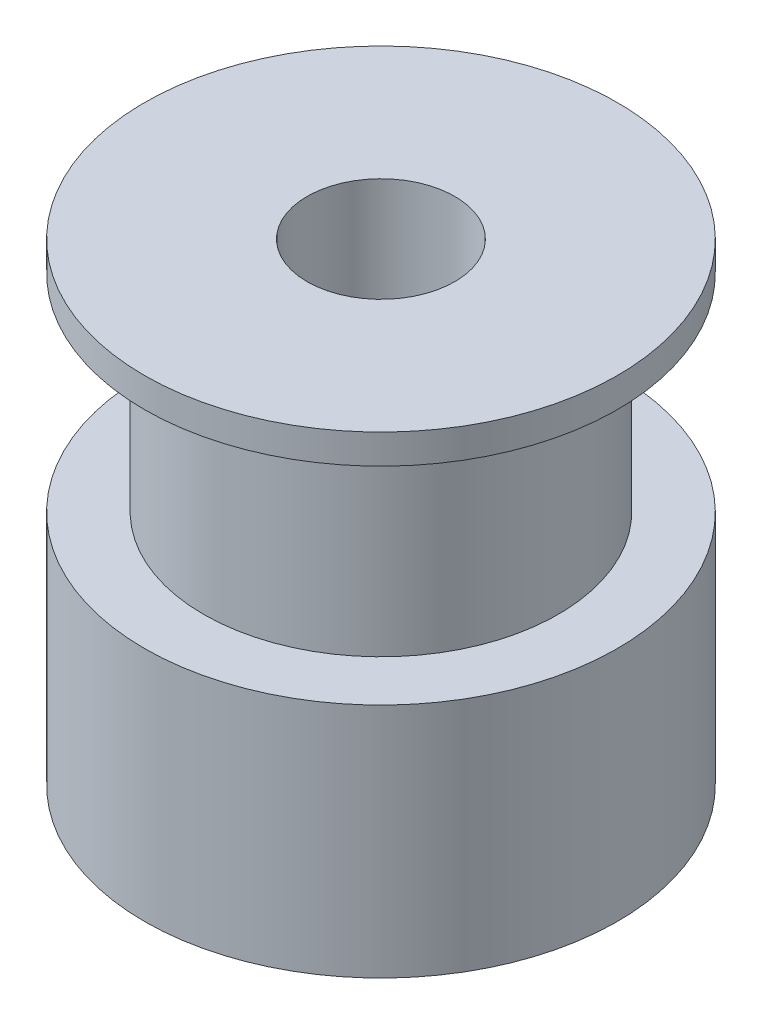
ISO-10303-21;
HEADER;
FILE_DESCRIPTION(('STEP AP214'),'2;1');
FILE_NAME('part.step','',(''),(''),'','','');
FILE_SCHEMA(('AUTOMOTIVE_DESIGN { 1 0 10303 214 1 1 1 1 }'));
ENDSEC;
DATA;
#1=APPLICATION_CONTEXT('core data for automotive mechanical design processes');
#2=APPLICATION_PROTOCOL_DEFINITION('international standard','automotive_design',2000,#1);
#3=PRODUCT_CONTEXT('',#1,'mechanical');
#4=PRODUCT('Part','Part','',(#3));
#5=PRODUCT_RELATED_PRODUCT_CATEGORY('part','',(#4));
#6=PRODUCT_DEFINITION_FORMATION('','',#4);
#7=PRODUCT_DEFINITION_CONTEXT('part definition',#1,'design');
#8=PRODUCT_DEFINITION('design','',#6,#7);
#9=PRODUCT_DEFINITION_SHAPE('','',#8);
#10=(LENGTH_UNIT() NAMED_UNIT(*) SI_UNIT(.MILLI.,.METRE.));
#11=(NAMED_UNIT(*) PLANE_ANGLE_UNIT() SI_UNIT($,.RADIAN.));
#12=(NAMED_UNIT(*) SI_UNIT($,.STERADIAN.) SOLID_ANGLE_UNIT());
#13=UNCERTAINTY_MEASURE_WITH_UNIT(LENGTH_MEASURE(1.E-05),#10,'distance_accuracy_value','');
#14=(GEOMETRIC_REPRESENTATION_CONTEXT(3) GLOBAL_UNCERTAINTY_ASSIGNED_CONTEXT((#13)) GLOBAL_UNIT_ASSIGNED_CONTEXT((#10,
#11,#12)) REPRESENTATION_CONTEXT('',''));
#15=CARTESIAN_POINT('',(0.,0.,0.));
#16=DIRECTION('',(0.,0.,1.));
#17=DIRECTION('',(1.,0.,0.));
#18=AXIS2_PLACEMENT_3D('',#15,#16,#17);
#19=CARTESIAN_POINT('',(0.,8.,0.));
#20=DIRECTION('',(0.,1.,0.));
#21=DIRECTION('',(0.,0.,1.));
#22=AXIS2_PLACEMENT_3D('',#19,#20,#21);
#23=PLANE('',#22);
#24=CARTESIAN_POINT('',(0.,8.,0.));
#25=DIRECTION('',(0.,1.,0.));
#26=DIRECTION('',(0.,0.,1.));
#27=AXIS2_PLACEMENT_3D('',#24,#25,#26);
#28=CIRCLE('',#27,8.);
#29=CARTESIAN_POINT('',(0.,8.,8.));
#30=VERTEX_POINT('',#29);
#31=EDGE_CURVE('E10',#30,#30,#28,.T.);
#32=ORIENTED_EDGE('',*,*,#31,.T.);
#33=EDGE_LOOP('',(#32));
#34=FACE_BOUND('',#33,.T.);
#35=CARTESIAN_POINT('',(0.,8.,0.));
#36=DIRECTION('',(0.,1.,0.));
#37=DIRECTION('',(0.,0.,1.));
#38=AXIS2_PLACEMENT_3D('',#35,#36,#37);
#39=CIRCLE('',#38,6.);
#40=CARTESIAN_POINT('',(0.,8.,6.));
#41=VERTEX_POINT('',#40);
#42=EDGE_CURVE('E53',#41,#41,#39,.T.);
#43=ORIENTED_EDGE('',*,*,#42,.F.);
#44=EDGE_LOOP('',(#43));
#45=FACE_BOUND('',#44,.T.);
#46=ADVANCED_FACE('F37',(#34,#45),#23,.T.);
#47=CARTESIAN_POINT('',(0.,0.,0.));
#48=DIRECTION('',(0.,1.,0.));
#49=DIRECTION('',(0.,0.,1.));
#50=AXIS2_PLACEMENT_3D('',#47,#48,#49);
#51=PLANE('',#50);
#52=CARTESIAN_POINT('',(0.,0.,0.));
#53=DIRECTION('',(0.,1.,0.));
#54=DIRECTION('',(0.,0.,1.));
#55=AXIS2_PLACEMENT_3D('',#52,#53,#54);
#56=CIRCLE('',#55,8.);
#57=CARTESIAN_POINT('',(0.,0.,8.));
#58=VERTEX_POINT('',#57);
#59=EDGE_CURVE('E41',#58,#58,#56,.T.);
#60=ORIENTED_EDGE('',*,*,#59,.F.);
#61=EDGE_LOOP('',(#60));
#62=FACE_BOUND('',#61,.T.);
#63=CARTESIAN_POINT('',(0.,0.,0.));
#64=DIRECTION('',(0.,1.,0.));
#65=DIRECTION('',(0.,0.,1.));
#66=AXIS2_PLACEMENT_3D('',#63,#64,#65);
#67=CIRCLE('',#66,2.5);
#68=CARTESIAN_POINT('',(0.,0.,2.5));
#69=VERTEX_POINT('',#68);
#70=EDGE_CURVE('E48',#69,#69,#67,.T.);
#71=ORIENTED_EDGE('',*,*,#70,.T.);
#72=EDGE_LOOP('',(#71));
#73=FACE_BOUND('',#72,.T.);
#74=ADVANCED_FACE('F86',(#62,#73),#51,.F.);
#75=CARTESIAN_POINT('',(0.,8.,0.));
#76=DIRECTION('',(0.,-1.,0.));
#77=DIRECTION('',(0.,0.,-1.));
#78=AXIS2_PLACEMENT_3D('',#75,#76,#77);
#79=CYLINDRICAL_SURFACE('',#78,8.);
#80=ORIENTED_EDGE('',*,*,#31,.F.);
#81=EDGE_LOOP('',(#80));
#82=FACE_BOUND('',#81,.T.);
#83=ORIENTED_EDGE('',*,*,#59,.T.);
#84=EDGE_LOOP('',(#83));
#85=FACE_BOUND('',#84,.T.);
#86=ADVANCED_FACE('F39',(#82,#85),#79,.T.);
#87=CARTESIAN_POINT('',(0.,8.,0.));
#88=DIRECTION('',(0.,-1.,0.));
#89=DIRECTION('',(0.,0.,-1.));
#90=AXIS2_PLACEMENT_3D('',#87,#88,#89);
#91=CYLINDRICAL_SURFACE('',#90,2.5);
#92=ORIENTED_EDGE('',*,*,#70,.F.);
#93=EDGE_LOOP('',(#92));
#94=FACE_BOUND('',#93,.T.);
#95=CARTESIAN_POINT('',(0.,16.,0.));
#96=DIRECTION('',(0.,1.,0.));
#97=DIRECTION('',(0.,0.,1.));
#98=AXIS2_PLACEMENT_3D('',#95,#96,#97);
#99=CIRCLE('',#98,2.5);
#100=CARTESIAN_POINT('',(0.,16.,2.5));
#101=VERTEX_POINT('',#100);
#102=EDGE_CURVE('E62',#101,#101,#99,.T.);
#103=ORIENTED_EDGE('',*,*,#102,.T.);
#104=EDGE_LOOP('',(#103));
#105=FACE_BOUND('',#104,.T.);
#106=ADVANCED_FACE('F68',(#94,#105),#91,.F.);
#107=CARTESIAN_POINT('',(0.,15.,0.));
#108=DIRECTION('',(0.,-1.,0.));
#109=DIRECTION('',(0.,0.,-1.));
#110=AXIS2_PLACEMENT_3D('',#107,#108,#109);
#111=CYLINDRICAL_SURFACE('',#110,6.);
#112=CARTESIAN_POINT('',(0.,15.,0.));
#113=DIRECTION('',(0.,1.,0.));
#114=DIRECTION('',(0.,0.,1.));
#115=AXIS2_PLACEMENT_3D('',#112,#113,#114);
#116=CIRCLE('',#115,6.);
#117=CARTESIAN_POINT('',(0.,15.,6.));
#118=VERTEX_POINT('',#117);
#119=EDGE_CURVE('E52',#118,#118,#116,.T.);
#120=ORIENTED_EDGE('',*,*,#119,.F.);
#121=EDGE_LOOP('',(#120));
#122=FACE_BOUND('',#121,.T.);
#123=ORIENTED_EDGE('',*,*,#42,.T.);
#124=EDGE_LOOP('',(#123));
#125=FACE_BOUND('',#124,.T.);
#126=ADVANCED_FACE('F73',(#122,#125),#111,.T.);
#127=CARTESIAN_POINT('',(0.,16.,0.));
#128=DIRECTION('',(0.,1.,0.));
#129=DIRECTION('',(0.,0.,1.));
#130=AXIS2_PLACEMENT_3D('',#127,#128,#129);
#131=PLANE('',#130);
#132=CARTESIAN_POINT('',(0.,16.,0.));
#133=DIRECTION('',(0.,1.,0.));
#134=DIRECTION('',(0.,0.,1.));
#135=AXIS2_PLACEMENT_3D('',#132,#133,#134);
#136=CIRCLE('',#135,8.);
#137=CARTESIAN_POINT('',(0.,16.,8.));
#138=VERTEX_POINT('',#137);
#139=EDGE_CURVE('E56',#138,#138,#136,.T.);
#140=ORIENTED_EDGE('',*,*,#139,.T.);
#141=EDGE_LOOP('',(#140));
#142=FACE_BOUND('',#141,.T.);
#143=ORIENTED_EDGE('',*,*,#102,.F.);
#144=EDGE_LOOP('',(#143));
#145=FACE_BOUND('',#144,.T.);
#146=ADVANCED_FACE('F70',(#142,#145),#131,.T.);
#147=CARTESIAN_POINT('',(0.,15.,0.));
#148=DIRECTION('',(0.,1.,0.));
#149=DIRECTION('',(0.,0.,1.));
#150=AXIS2_PLACEMENT_3D('',#147,#148,#149);
#151=PLANE('',#150);
#152=ORIENTED_EDGE('',*,*,#119,.T.);
#153=EDGE_LOOP('',(#152));
#154=FACE_BOUND('',#153,.T.);
#155=CARTESIAN_POINT('',(0.,15.,0.));
#156=DIRECTION('',(0.,1.,0.));
#157=DIRECTION('',(0.,0.,1.));
#158=AXIS2_PLACEMENT_3D('',#155,#156,#157);
#159=CIRCLE('',#158,8.);
#160=CARTESIAN_POINT('',(0.,15.,8.));
#161=VERTEX_POINT('',#160);
#162=EDGE_CURVE('E59',#161,#161,#159,.T.);
#163=ORIENTED_EDGE('',*,*,#162,.F.);
#164=EDGE_LOOP('',(#163));
#165=FACE_BOUND('',#164,.T.);
#166=ADVANCED_FACE('F72',(#154,#165),#151,.F.);
#167=CARTESIAN_POINT('',(0.,16.,0.));
#168=DIRECTION('',(0.,-1.,0.));
#169=DIRECTION('',(0.,0.,-1.));
#170=AXIS2_PLACEMENT_3D('',#167,#168,#169);
#171=CYLINDRICAL_SURFACE('',#170,8.);
#172=ORIENTED_EDGE('',*,*,#139,.F.);
#173=EDGE_LOOP('',(#172));
#174=FACE_BOUND('',#173,.T.);
#175=ORIENTED_EDGE('',*,*,#162,.T.);
#176=EDGE_LOOP('',(#175));
#177=FACE_BOUND('',#176,.T.);
#178=ADVANCED_FACE('F80',(#174,#177),#171,.T.);
#179=CLOSED_SHELL('',(#46,#74,#86,#106,#126,#146,#166,#178));
#180=MANIFOLD_SOLID_BREP('B2',#179);
#181=ADVANCED_BREP_SHAPE_REPRESENTATION('',(#18,#180),#14);
#182=SHAPE_DEFINITION_REPRESENTATION(#9,#181);
ENDSEC;
END-ISO-10303-21;
